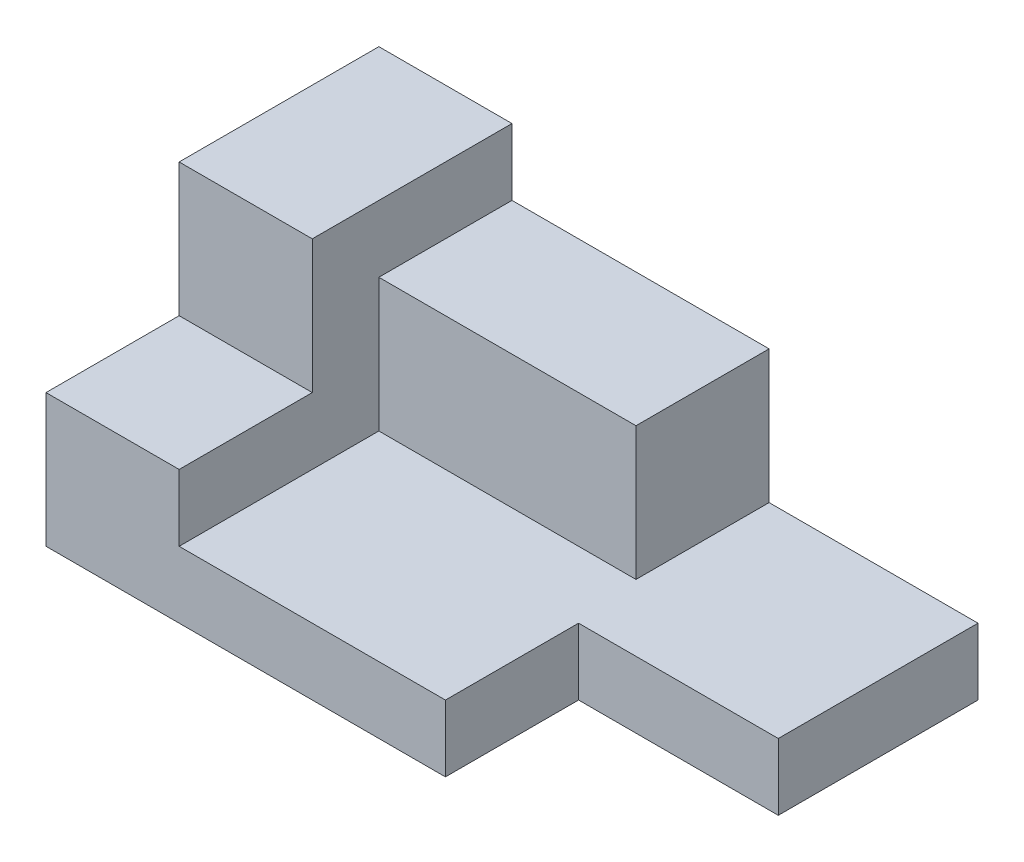
ISO-10303-21;
HEADER;
FILE_DESCRIPTION(('STEP AP214'),'2;1');
FILE_NAME('part.step','',(''),(''),'','','');
FILE_SCHEMA(('AUTOMOTIVE_DESIGN { 1 0 10303 214 1 1 1 1 }'));
ENDSEC;
DATA;
#1=APPLICATION_CONTEXT('core data for automotive mechanical design processes');
#2=APPLICATION_PROTOCOL_DEFINITION('international standard','automotive_design',2000,#1);
#3=PRODUCT_CONTEXT('',#1,'mechanical');
#4=PRODUCT('Part','Part','',(#3));
#5=PRODUCT_RELATED_PRODUCT_CATEGORY('part','',(#4));
#6=PRODUCT_DEFINITION_FORMATION('','',#4);
#7=PRODUCT_DEFINITION_CONTEXT('part definition',#1,'design');
#8=PRODUCT_DEFINITION('design','',#6,#7);
#9=PRODUCT_DEFINITION_SHAPE('','',#8);
#10=(LENGTH_UNIT() NAMED_UNIT(*) SI_UNIT(.MILLI.,.METRE.));
#11=(NAMED_UNIT(*) PLANE_ANGLE_UNIT() SI_UNIT($,.RADIAN.));
#12=(NAMED_UNIT(*) SI_UNIT($,.STERADIAN.) SOLID_ANGLE_UNIT());
#13=UNCERTAINTY_MEASURE_WITH_UNIT(LENGTH_MEASURE(1.E-05),#10,'distance_accuracy_value','');
#14=(GEOMETRIC_REPRESENTATION_CONTEXT(3) GLOBAL_UNCERTAINTY_ASSIGNED_CONTEXT((#13)) GLOBAL_UNIT_ASSIGNED_CONTEXT((#10,
#11,#12)) REPRESENTATION_CONTEXT('',''));
#15=CARTESIAN_POINT('',(0.,0.,0.));
#16=DIRECTION('',(0.,0.,1.));
#17=DIRECTION('',(1.,0.,0.));
#18=AXIS2_PLACEMENT_3D('',#15,#16,#17);
#19=CARTESIAN_POINT('',(0.,10.,0.));
#20=DIRECTION('',(0.,1.,0.));
#21=DIRECTION('',(0.,0.,1.));
#22=AXIS2_PLACEMENT_3D('',#19,#20,#21);
#23=PLANE('',#22);
#24=DIRECTION('',(-1.,0.,0.));
#25=VECTOR('',#24,1.);
#26=CARTESIAN_POINT('',(58.6224232963355,10.,-30.));
#27=LINE('',#26,#25);
#28=CARTESIAN_POINT('',(58.6224232963355,10.,-30.));
#29=VERTEX_POINT('',#28);
#30=CARTESIAN_POINT('',(20.,10.,-30.));
#31=VERTEX_POINT('',#30);
#32=EDGE_CURVE('E162',#29,#31,#27,.T.);
#33=ORIENTED_EDGE('',*,*,#32,.T.);
#34=DIRECTION('',(0.,0.,-1.));
#35=VECTOR('',#34,1.);
#36=CARTESIAN_POINT('',(20.,10.,0.));
#37=LINE('',#36,#35);
#38=CARTESIAN_POINT('',(20.,10.,0.));
#39=VERTEX_POINT('',#38);
#40=EDGE_CURVE('E54',#39,#31,#37,.T.);
#41=ORIENTED_EDGE('',*,*,#40,.F.);
#42=DIRECTION('',(1.,0.,0.));
#43=VECTOR('',#42,1.);
#44=CARTESIAN_POINT('',(0.,10.,0.));
#45=LINE('',#44,#43);
#46=CARTESIAN_POINT('',(60.,10.,0.));
#47=VERTEX_POINT('',#46);
#48=EDGE_CURVE('E196',#39,#47,#45,.T.);
#49=ORIENTED_EDGE('',*,*,#48,.T.);
#50=DIRECTION('',(0.,0.,-1.));
#51=VECTOR('',#50,1.);
#52=CARTESIAN_POINT('',(60.,10.,0.));
#53=LINE('',#52,#51);
#54=CARTESIAN_POINT('',(60.,10.,-20.));
#55=VERTEX_POINT('',#54);
#56=EDGE_CURVE('E198',#47,#55,#53,.T.);
#57=ORIENTED_EDGE('',*,*,#56,.T.);
#58=DIRECTION('',(1.,0.,0.));
#59=VECTOR('',#58,1.);
#60=CARTESIAN_POINT('',(60.,10.,-20.));
#61=LINE('',#60,#59);
#62=CARTESIAN_POINT('',(90.,10.,-20.));
#63=VERTEX_POINT('',#62);
#64=EDGE_CURVE('E201',#55,#63,#61,.T.);
#65=ORIENTED_EDGE('',*,*,#64,.T.);
#66=DIRECTION('',(0.,0.,-1.));
#67=VECTOR('',#66,1.);
#68=CARTESIAN_POINT('',(90.,10.,-20.));
#69=LINE('',#68,#67);
#70=CARTESIAN_POINT('',(90.,10.,-50.));
#71=VERTEX_POINT('',#70);
#72=EDGE_CURVE('E203',#63,#71,#69,.T.);
#73=ORIENTED_EDGE('',*,*,#72,.T.);
#74=DIRECTION('',(-1.,0.,0.));
#75=VECTOR('',#74,1.);
#76=CARTESIAN_POINT('',(90.,10.,-50.));
#77=LINE('',#76,#75);
#78=CARTESIAN_POINT('',(58.6224232963355,10.,-50.));
#79=VERTEX_POINT('',#78);
#80=EDGE_CURVE('E205',#71,#79,#77,.T.);
#81=ORIENTED_EDGE('',*,*,#80,.T.);
#82=DIRECTION('',(0.,0.,1.));
#83=VECTOR('',#82,1.);
#84=CARTESIAN_POINT('',(58.6224232963355,10.,-50.));
#85=LINE('',#84,#83);
#86=EDGE_CURVE('E171',#79,#29,#85,.T.);
#87=ORIENTED_EDGE('',*,*,#86,.T.);
#88=EDGE_LOOP('',(#33,#41,#49,#57,#65,#73,#81,#87));
#89=FACE_BOUND('',#88,.T.);
#90=ADVANCED_FACE('F39',(#89),#23,.T.);
#91=CARTESIAN_POINT('',(58.6224232963355,30.,-30.));
#92=DIRECTION('',(0.,0.,1.));
#93=DIRECTION('',(1.,0.,0.));
#94=AXIS2_PLACEMENT_3D('',#91,#92,#93);
#95=PLANE('',#94);
#96=DIRECTION('',(-1.,0.,0.));
#97=VECTOR('',#96,1.);
#98=CARTESIAN_POINT('',(58.6224232963355,30.,-30.));
#99=LINE('',#98,#97);
#100=CARTESIAN_POINT('',(58.6224232963355,30.,-30.));
#101=VERTEX_POINT('',#100);
#102=CARTESIAN_POINT('',(20.,30.,-30.));
#103=VERTEX_POINT('',#102);
#104=EDGE_CURVE('E168',#101,#103,#99,.T.);
#105=ORIENTED_EDGE('',*,*,#104,.T.);
#106=DIRECTION('',(0.,-1.,0.));
#107=VECTOR('',#106,1.);
#108=CARTESIAN_POINT('',(20.,30.,-30.));
#109=LINE('',#108,#107);
#110=EDGE_CURVE('E160',#103,#31,#109,.T.);
#111=ORIENTED_EDGE('',*,*,#110,.T.);
#112=ORIENTED_EDGE('',*,*,#32,.F.);
#113=DIRECTION('',(0.,-1.,0.));
#114=VECTOR('',#113,1.);
#115=CARTESIAN_POINT('',(58.6224232963355,30.,-30.));
#116=LINE('',#115,#114);
#117=EDGE_CURVE('E180',#101,#29,#116,.T.);
#118=ORIENTED_EDGE('',*,*,#117,.F.);
#119=EDGE_LOOP('',(#105,#111,#112,#118));
#120=FACE_BOUND('',#119,.T.);
#121=ADVANCED_FACE('F271',(#120),#95,.T.);
#122=CARTESIAN_POINT('',(0.,30.,0.));
#123=DIRECTION('',(0.,1.,0.));
#124=DIRECTION('',(0.,0.,1.));
#125=AXIS2_PLACEMENT_3D('',#122,#123,#124);
#126=PLANE('',#125);
#127=DIRECTION('',(-1.,0.,0.));
#128=VECTOR('',#127,1.);
#129=CARTESIAN_POINT('',(58.6224232963355,30.,-50.));
#130=LINE('',#129,#128);
#131=CARTESIAN_POINT('',(58.6224232963355,30.,-50.));
#132=VERTEX_POINT('',#131);
#133=CARTESIAN_POINT('',(20.,30.,-50.));
#134=VERTEX_POINT('',#133);
#135=EDGE_CURVE('E61',#132,#134,#130,.T.);
#136=ORIENTED_EDGE('',*,*,#135,.T.);
#137=DIRECTION('',(0.,0.,1.));
#138=VECTOR('',#137,1.);
#139=CARTESIAN_POINT('',(20.,30.,0.));
#140=LINE('',#139,#138);
#141=EDGE_CURVE('E11',#134,#103,#140,.T.);
#142=ORIENTED_EDGE('',*,*,#141,.T.);
#143=ORIENTED_EDGE('',*,*,#104,.F.);
#144=DIRECTION('',(0.,0.,1.));
#145=VECTOR('',#144,1.);
#146=CARTESIAN_POINT('',(58.6224232963355,30.,-50.));
#147=LINE('',#146,#145);
#148=EDGE_CURVE('E173',#132,#101,#147,.T.);
#149=ORIENTED_EDGE('',*,*,#148,.F.);
#150=EDGE_LOOP('',(#136,#142,#143,#149));
#151=FACE_BOUND('',#150,.T.);
#152=ADVANCED_FACE('F276',(#151),#126,.T.);
#153=CARTESIAN_POINT('',(0.,10.,-50.));
#154=DIRECTION('',(1.,0.,0.));
#155=DIRECTION('',(0.,0.,-1.));
#156=AXIS2_PLACEMENT_3D('',#153,#154,#155);
#157=PLANE('',#156);
#158=DIRECTION('',(0.,0.,1.));
#159=VECTOR('',#158,1.);
#160=CARTESIAN_POINT('',(0.,0.,-50.));
#161=LINE('',#160,#159);
#162=CARTESIAN_POINT('',(0.,0.,-50.));
#163=VERTEX_POINT('',#162);
#164=CARTESIAN_POINT('',(0.,0.,0.));
#165=VERTEX_POINT('',#164);
#166=EDGE_CURVE('E195',#163,#165,#161,.T.);
#167=ORIENTED_EDGE('',*,*,#166,.T.);
#168=DIRECTION('',(0.,-1.,0.));
#169=VECTOR('',#168,1.);
#170=CARTESIAN_POINT('',(0.,10.,0.));
#171=LINE('',#170,#169);
#172=CARTESIAN_POINT('',(0.,20.,0.));
#173=VERTEX_POINT('',#172);
#174=EDGE_CURVE('E47',#173,#165,#171,.T.);
#175=ORIENTED_EDGE('',*,*,#174,.F.);
#176=DIRECTION('',(0.,0.,-1.));
#177=VECTOR('',#176,1.);
#178=CARTESIAN_POINT('',(0.,20.,0.));
#179=LINE('',#178,#177);
#180=CARTESIAN_POINT('',(0.,20.,-20.));
#181=VERTEX_POINT('',#180);
#182=EDGE_CURVE('E159',#173,#181,#179,.T.);
#183=ORIENTED_EDGE('',*,*,#182,.T.);
#184=DIRECTION('',(0.,-1.,0.));
#185=VECTOR('',#184,1.);
#186=CARTESIAN_POINT('',(0.,40.,-20.));
#187=LINE('',#186,#185);
#188=CARTESIAN_POINT('',(0.,40.,-20.));
#189=VERTEX_POINT('',#188);
#190=EDGE_CURVE('E140',#189,#181,#187,.T.);
#191=ORIENTED_EDGE('',*,*,#190,.F.);
#192=DIRECTION('',(0.,0.,1.));
#193=VECTOR('',#192,1.);
#194=CARTESIAN_POINT('',(0.,40.,-50.));
#195=LINE('',#194,#193);
#196=CARTESIAN_POINT('',(0.,40.,-50.));
#197=VERTEX_POINT('',#196);
#198=EDGE_CURVE('E146',#197,#189,#195,.T.);
#199=ORIENTED_EDGE('',*,*,#198,.F.);
#200=DIRECTION('',(0.,-1.,0.));
#201=VECTOR('',#200,1.);
#202=CARTESIAN_POINT('',(0.,10.,-50.));
#203=LINE('',#202,#201);
#204=EDGE_CURVE('E207',#197,#163,#203,.T.);
#205=ORIENTED_EDGE('',*,*,#204,.T.);
#206=EDGE_LOOP('',(#167,#175,#183,#191,#199,#205));
#207=FACE_BOUND('',#206,.T.);
#208=ADVANCED_FACE('F41',(#207),#157,.F.);
#209=CARTESIAN_POINT('',(0.,10.,0.));
#210=DIRECTION('',(0.,0.,-1.));
#211=DIRECTION('',(-1.,0.,0.));
#212=AXIS2_PLACEMENT_3D('',#209,#210,#211);
#213=PLANE('',#212);
#214=DIRECTION('',(1.,0.,0.));
#215=VECTOR('',#214,1.);
#216=CARTESIAN_POINT('',(0.,0.,0.));
#217=LINE('',#216,#215);
#218=CARTESIAN_POINT('',(60.,0.,0.));
#219=VERTEX_POINT('',#218);
#220=EDGE_CURVE('E209',#165,#219,#217,.T.);
#221=ORIENTED_EDGE('',*,*,#220,.T.);
#222=DIRECTION('',(0.,-1.,0.));
#223=VECTOR('',#222,1.);
#224=CARTESIAN_POINT('',(60.,10.,0.));
#225=LINE('',#224,#223);
#226=EDGE_CURVE('E229',#47,#219,#225,.T.);
#227=ORIENTED_EDGE('',*,*,#226,.F.);
#228=ORIENTED_EDGE('',*,*,#48,.F.);
#229=DIRECTION('',(0.,-1.,0.));
#230=VECTOR('',#229,1.);
#231=CARTESIAN_POINT('',(20.,20.,0.));
#232=LINE('',#231,#230);
#233=CARTESIAN_POINT('',(20.,20.,0.));
#234=VERTEX_POINT('',#233);
#235=EDGE_CURVE('E192',#234,#39,#232,.T.);
#236=ORIENTED_EDGE('',*,*,#235,.F.);
#237=DIRECTION('',(1.,0.,0.));
#238=VECTOR('',#237,1.);
#239=CARTESIAN_POINT('',(0.,20.,0.));
#240=LINE('',#239,#238);
#241=EDGE_CURVE('E189',#173,#234,#240,.T.);
#242=ORIENTED_EDGE('',*,*,#241,.F.);
#243=ORIENTED_EDGE('',*,*,#174,.T.);
#244=EDGE_LOOP('',(#221,#227,#228,#236,#242,#243));
#245=FACE_BOUND('',#244,.T.);
#246=ADVANCED_FACE('F234',(#245),#213,.F.);
#247=CARTESIAN_POINT('',(60.,10.,0.));
#248=DIRECTION('',(-1.,0.,0.));
#249=DIRECTION('',(0.,0.,1.));
#250=AXIS2_PLACEMENT_3D('',#247,#248,#249);
#251=PLANE('',#250);
#252=DIRECTION('',(0.,0.,-1.));
#253=VECTOR('',#252,1.);
#254=CARTESIAN_POINT('',(60.,0.,0.));
#255=LINE('',#254,#253);
#256=CARTESIAN_POINT('',(60.,0.,-20.));
#257=VERTEX_POINT('',#256);
#258=EDGE_CURVE('E211',#219,#257,#255,.T.);
#259=ORIENTED_EDGE('',*,*,#258,.T.);
#260=DIRECTION('',(0.,-1.,0.));
#261=VECTOR('',#260,1.);
#262=CARTESIAN_POINT('',(60.,10.,-20.));
#263=LINE('',#262,#261);
#264=EDGE_CURVE('E226',#55,#257,#263,.T.);
#265=ORIENTED_EDGE('',*,*,#264,.F.);
#266=ORIENTED_EDGE('',*,*,#56,.F.);
#267=ORIENTED_EDGE('',*,*,#226,.T.);
#268=EDGE_LOOP('',(#259,#265,#266,#267));
#269=FACE_BOUND('',#268,.T.);
#270=ADVANCED_FACE('F245',(#269),#251,.F.);
#271=CARTESIAN_POINT('',(60.,10.,-20.));
#272=DIRECTION('',(0.,0.,-1.));
#273=DIRECTION('',(-1.,0.,0.));
#274=AXIS2_PLACEMENT_3D('',#271,#272,#273);
#275=PLANE('',#274);
#276=DIRECTION('',(1.,0.,0.));
#277=VECTOR('',#276,1.);
#278=CARTESIAN_POINT('',(60.,0.,-20.));
#279=LINE('',#278,#277);
#280=CARTESIAN_POINT('',(90.,0.,-20.));
#281=VERTEX_POINT('',#280);
#282=EDGE_CURVE('E213',#257,#281,#279,.T.);
#283=ORIENTED_EDGE('',*,*,#282,.T.);
#284=DIRECTION('',(0.,-1.,0.));
#285=VECTOR('',#284,1.);
#286=CARTESIAN_POINT('',(90.,10.,-20.));
#287=LINE('',#286,#285);
#288=EDGE_CURVE('E223',#63,#281,#287,.T.);
#289=ORIENTED_EDGE('',*,*,#288,.F.);
#290=ORIENTED_EDGE('',*,*,#64,.F.);
#291=ORIENTED_EDGE('',*,*,#264,.T.);
#292=EDGE_LOOP('',(#283,#289,#290,#291));
#293=FACE_BOUND('',#292,.T.);
#294=ADVANCED_FACE('F249',(#293),#275,.F.);
#295=CARTESIAN_POINT('',(90.,10.,-20.));
#296=DIRECTION('',(-1.,0.,0.));
#297=DIRECTION('',(0.,0.,1.));
#298=AXIS2_PLACEMENT_3D('',#295,#296,#297);
#299=PLANE('',#298);
#300=DIRECTION('',(0.,0.,-1.));
#301=VECTOR('',#300,1.);
#302=CARTESIAN_POINT('',(90.,0.,-20.));
#303=LINE('',#302,#301);
#304=CARTESIAN_POINT('',(90.,0.,-50.));
#305=VERTEX_POINT('',#304);
#306=EDGE_CURVE('E215',#281,#305,#303,.T.);
#307=ORIENTED_EDGE('',*,*,#306,.T.);
#308=DIRECTION('',(0.,-1.,0.));
#309=VECTOR('',#308,1.);
#310=CARTESIAN_POINT('',(90.,10.,-50.));
#311=LINE('',#310,#309);
#312=EDGE_CURVE('E220',#71,#305,#311,.T.);
#313=ORIENTED_EDGE('',*,*,#312,.F.);
#314=ORIENTED_EDGE('',*,*,#72,.F.);
#315=ORIENTED_EDGE('',*,*,#288,.T.);
#316=EDGE_LOOP('',(#307,#313,#314,#315));
#317=FACE_BOUND('',#316,.T.);
#318=ADVANCED_FACE('F284',(#317),#299,.F.);
#319=CARTESIAN_POINT('',(60.,10.,-50.));
#320=DIRECTION('',(0.,0.,1.));
#321=DIRECTION('',(1.,0.,0.));
#322=AXIS2_PLACEMENT_3D('',#319,#320,#321);
#323=PLANE('',#322);
#324=DIRECTION('',(0.,-1.,0.));
#325=VECTOR('',#324,1.);
#326=CARTESIAN_POINT('',(20.,40.,-50.));
#327=LINE('',#326,#325);
#328=CARTESIAN_POINT('',(20.,40.,-50.));
#329=VERTEX_POINT('',#328);
#330=EDGE_CURVE('E164',#329,#134,#327,.T.);
#331=ORIENTED_EDGE('',*,*,#330,.T.);
#332=ORIENTED_EDGE('',*,*,#135,.F.);
#333=DIRECTION('',(0.,-1.,0.));
#334=VECTOR('',#333,1.);
#335=CARTESIAN_POINT('',(58.6224232963355,30.,-50.));
#336=LINE('',#335,#334);
#337=EDGE_CURVE('E176',#132,#79,#336,.T.);
#338=ORIENTED_EDGE('',*,*,#337,.T.);
#339=ORIENTED_EDGE('',*,*,#80,.F.);
#340=ORIENTED_EDGE('',*,*,#312,.T.);
#341=DIRECTION('',(-1.,0.,0.));
#342=VECTOR('',#341,1.);
#343=CARTESIAN_POINT('',(60.,0.,-50.));
#344=LINE('',#343,#342);
#345=EDGE_CURVE('E199',#305,#163,#344,.T.);
#346=ORIENTED_EDGE('',*,*,#345,.T.);
#347=ORIENTED_EDGE('',*,*,#204,.F.);
#348=DIRECTION('',(-1.,0.,0.));
#349=VECTOR('',#348,1.);
#350=CARTESIAN_POINT('',(0.,40.,-50.));
#351=LINE('',#350,#349);
#352=EDGE_CURVE('E152',#329,#197,#351,.T.);
#353=ORIENTED_EDGE('',*,*,#352,.F.);
#354=EDGE_LOOP('',(#331,#332,#338,#339,#340,#346,#347,#353));
#355=FACE_BOUND('',#354,.T.);
#356=ADVANCED_FACE('F281',(#355),#323,.F.);
#357=CARTESIAN_POINT('',(0.,0.,0.));
#358=DIRECTION('',(0.,1.,0.));
#359=DIRECTION('',(0.,0.,1.));
#360=AXIS2_PLACEMENT_3D('',#357,#358,#359);
#361=PLANE('',#360);
#362=ORIENTED_EDGE('',*,*,#166,.F.);
#363=ORIENTED_EDGE('',*,*,#345,.F.);
#364=ORIENTED_EDGE('',*,*,#306,.F.);
#365=ORIENTED_EDGE('',*,*,#282,.F.);
#366=ORIENTED_EDGE('',*,*,#258,.F.);
#367=ORIENTED_EDGE('',*,*,#220,.F.);
#368=EDGE_LOOP('',(#362,#363,#364,#365,#366,#367));
#369=FACE_BOUND('',#368,.T.);
#370=ADVANCED_FACE('F239',(#369),#361,.F.);
#371=CARTESIAN_POINT('',(20.,20.,0.));
#372=DIRECTION('',(-1.,0.,0.));
#373=DIRECTION('',(0.,0.,1.));
#374=AXIS2_PLACEMENT_3D('',#371,#372,#373);
#375=PLANE('',#374);
#376=ORIENTED_EDGE('',*,*,#40,.T.);
#377=ORIENTED_EDGE('',*,*,#110,.F.);
#378=ORIENTED_EDGE('',*,*,#141,.F.);
#379=ORIENTED_EDGE('',*,*,#330,.F.);
#380=DIRECTION('',(0.,0.,-1.));
#381=VECTOR('',#380,1.);
#382=CARTESIAN_POINT('',(20.,40.,-50.));
#383=LINE('',#382,#381);
#384=CARTESIAN_POINT('',(20.,40.,-20.));
#385=VERTEX_POINT('',#384);
#386=EDGE_CURVE('E145',#385,#329,#383,.T.);
#387=ORIENTED_EDGE('',*,*,#386,.F.);
#388=DIRECTION('',(0.,-1.,0.));
#389=VECTOR('',#388,1.);
#390=CARTESIAN_POINT('',(20.,40.,-20.));
#391=LINE('',#390,#389);
#392=CARTESIAN_POINT('',(20.,20.,-20.));
#393=VERTEX_POINT('',#392);
#394=EDGE_CURVE('E142',#385,#393,#391,.T.);
#395=ORIENTED_EDGE('',*,*,#394,.T.);
#396=DIRECTION('',(0.,0.,-1.));
#397=VECTOR('',#396,1.);
#398=CARTESIAN_POINT('',(20.,20.,0.));
#399=LINE('',#398,#397);
#400=EDGE_CURVE('E187',#234,#393,#399,.T.);
#401=ORIENTED_EDGE('',*,*,#400,.F.);
#402=ORIENTED_EDGE('',*,*,#235,.T.);
#403=EDGE_LOOP('',(#376,#377,#378,#379,#387,#395,#401,#402));
#404=FACE_BOUND('',#403,.T.);
#405=ADVANCED_FACE('F256',(#404),#375,.F.);
#406=CARTESIAN_POINT('',(0.,20.,0.));
#407=DIRECTION('',(0.,1.,0.));
#408=DIRECTION('',(0.,0.,1.));
#409=AXIS2_PLACEMENT_3D('',#406,#407,#408);
#410=PLANE('',#409);
#411=DIRECTION('',(1.,0.,0.));
#412=VECTOR('',#411,1.);
#413=CARTESIAN_POINT('',(0.,20.,-20.));
#414=LINE('',#413,#412);
#415=EDGE_CURVE('E185',#181,#393,#414,.T.);
#416=ORIENTED_EDGE('',*,*,#415,.F.);
#417=ORIENTED_EDGE('',*,*,#182,.F.);
#418=ORIENTED_EDGE('',*,*,#241,.T.);
#419=ORIENTED_EDGE('',*,*,#400,.T.);
#420=EDGE_LOOP('',(#416,#417,#418,#419));
#421=FACE_BOUND('',#420,.T.);
#422=ADVANCED_FACE('F258',(#421),#410,.T.);
#423=CARTESIAN_POINT('',(58.6224232963355,30.,-50.));
#424=DIRECTION('',(1.,0.,0.));
#425=DIRECTION('',(0.,0.,-1.));
#426=AXIS2_PLACEMENT_3D('',#423,#424,#425);
#427=PLANE('',#426);
#428=ORIENTED_EDGE('',*,*,#86,.F.);
#429=ORIENTED_EDGE('',*,*,#337,.F.);
#430=ORIENTED_EDGE('',*,*,#148,.T.);
#431=ORIENTED_EDGE('',*,*,#117,.T.);
#432=EDGE_LOOP('',(#428,#429,#430,#431));
#433=FACE_BOUND('',#432,.T.);
#434=ADVANCED_FACE('F260',(#433),#427,.T.);
#435=CARTESIAN_POINT('',(0.,40.,-20.));
#436=DIRECTION('',(0.,0.,-1.));
#437=DIRECTION('',(-1.,0.,0.));
#438=AXIS2_PLACEMENT_3D('',#435,#436,#437);
#439=PLANE('',#438);
#440=ORIENTED_EDGE('',*,*,#415,.T.);
#441=ORIENTED_EDGE('',*,*,#394,.F.);
#442=DIRECTION('',(1.,0.,0.));
#443=VECTOR('',#442,1.);
#444=CARTESIAN_POINT('',(0.,40.,-20.));
#445=LINE('',#444,#443);
#446=EDGE_CURVE('E135',#189,#385,#445,.T.);
#447=ORIENTED_EDGE('',*,*,#446,.F.);
#448=ORIENTED_EDGE('',*,*,#190,.T.);
#449=EDGE_LOOP('',(#440,#441,#447,#448));
#450=FACE_BOUND('',#449,.T.);
#451=ADVANCED_FACE('F138',(#450),#439,.F.);
#452=CARTESIAN_POINT('',(0.,40.,0.));
#453=DIRECTION('',(0.,1.,0.));
#454=DIRECTION('',(0.,0.,1.));
#455=AXIS2_PLACEMENT_3D('',#452,#453,#454);
#456=PLANE('',#455);
#457=ORIENTED_EDGE('',*,*,#198,.T.);
#458=ORIENTED_EDGE('',*,*,#446,.T.);
#459=ORIENTED_EDGE('',*,*,#386,.T.);
#460=ORIENTED_EDGE('',*,*,#352,.T.);
#461=EDGE_LOOP('',(#457,#458,#459,#460));
#462=FACE_BOUND('',#461,.T.);
#463=ADVANCED_FACE('F150',(#462),#456,.T.);
#464=CLOSED_SHELL('',(#90,#121,#152,#208,#246,#270,#294,#318,#356,#370,#405,#422,#434,#451,#463));
#465=MANIFOLD_SOLID_BREP('B2',#464);
#466=ADVANCED_BREP_SHAPE_REPRESENTATION('',(#18,#465),#14);
#467=SHAPE_DEFINITION_REPRESENTATION(#9,#466);
ENDSEC;
END-ISO-10303-21;
